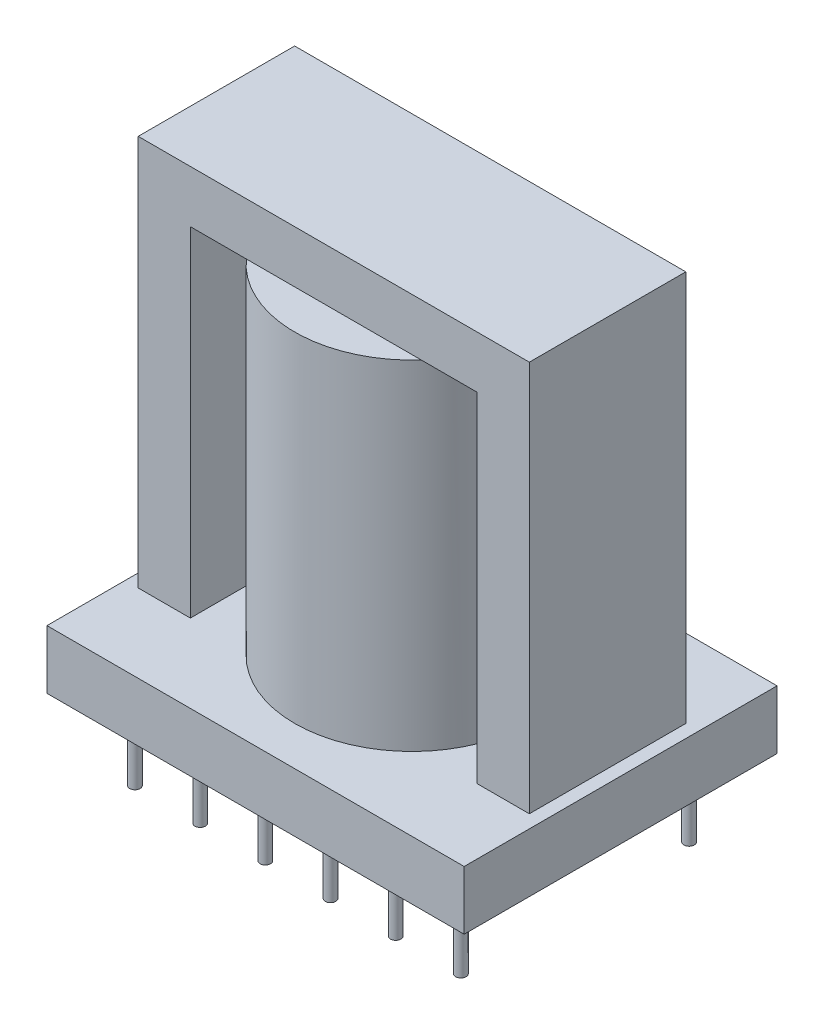
ISO-10303-21;
HEADER;
FILE_DESCRIPTION(('STEP AP214'),'2;1');
FILE_NAME('part.step','',(''),(''),'','','');
FILE_SCHEMA(('AUTOMOTIVE_DESIGN { 1 0 10303 214 1 1 1 1 }'));
ENDSEC;
DATA;
#1=APPLICATION_CONTEXT('core data for automotive mechanical design processes');
#2=APPLICATION_PROTOCOL_DEFINITION('international standard','automotive_design',2000,#1);
#3=PRODUCT_CONTEXT('',#1,'mechanical');
#4=PRODUCT('Part','Part','',(#3));
#5=PRODUCT_RELATED_PRODUCT_CATEGORY('part','',(#4));
#6=PRODUCT_DEFINITION_FORMATION('','',#4);
#7=PRODUCT_DEFINITION_CONTEXT('part definition',#1,'design');
#8=PRODUCT_DEFINITION('design','',#6,#7);
#9=PRODUCT_DEFINITION_SHAPE('','',#8);
#10=(LENGTH_UNIT() NAMED_UNIT(*) SI_UNIT(.MILLI.,.METRE.));
#11=(NAMED_UNIT(*) PLANE_ANGLE_UNIT() SI_UNIT($,.RADIAN.));
#12=(NAMED_UNIT(*) SI_UNIT($,.STERADIAN.) SOLID_ANGLE_UNIT());
#13=UNCERTAINTY_MEASURE_WITH_UNIT(LENGTH_MEASURE(1.E-05),#10,'distance_accuracy_value','');
#14=(GEOMETRIC_REPRESENTATION_CONTEXT(3) GLOBAL_UNCERTAINTY_ASSIGNED_CONTEXT((#13)) GLOBAL_UNIT_ASSIGNED_CONTEXT((#10,
#11,#12)) REPRESENTATION_CONTEXT('',''));
#15=CARTESIAN_POINT('',(0.,0.,0.));
#16=DIRECTION('',(0.,0.,1.));
#17=DIRECTION('',(1.,0.,0.));
#18=AXIS2_PLACEMENT_3D('',#15,#16,#17);
#19=CARTESIAN_POINT('',(0.,30.5,0.));
#20=DIRECTION('',(0.,1.,0.));
#21=DIRECTION('',(0.,0.,1.));
#22=AXIS2_PLACEMENT_3D('',#19,#20,#21);
#23=PLANE('',#22);
#24=DIRECTION('',(-1.,0.,0.));
#25=VECTOR('',#24,1.);
#26=CARTESIAN_POINT('',(-15.,30.5,-6.));
#27=LINE('',#26,#25);
#28=CARTESIAN_POINT('',(6.70820393249937,30.5,-6.));
#29=VERTEX_POINT('',#28);
#30=CARTESIAN_POINT('',(-6.70820393249937,30.5,-6.));
#31=VERTEX_POINT('',#30);
#32=EDGE_CURVE('E176',#29,#31,#27,.T.);
#33=ORIENTED_EDGE('',*,*,#32,.F.);
#34=CARTESIAN_POINT('',(0.,30.5,0.));
#35=DIRECTION('',(0.,1.,0.));
#36=DIRECTION('',(0.,0.,1.));
#37=AXIS2_PLACEMENT_3D('',#34,#35,#36);
#38=CIRCLE('',#37,9.);
#39=EDGE_CURVE('E224',#29,#31,#38,.T.);
#40=ORIENTED_EDGE('',*,*,#39,.T.);
#41=EDGE_LOOP('',(#33,#40));
#42=FACE_BOUND('',#41,.T.);
#43=ADVANCED_FACE('F37',(#42),#23,.T.);
#44=CARTESIAN_POINT('',(0.,4.5,0.));
#45=DIRECTION('',(0.,1.,0.));
#46=DIRECTION('',(0.,0.,1.));
#47=AXIS2_PLACEMENT_3D('',#44,#45,#46);
#48=PLANE('',#47);
#49=CARTESIAN_POINT('',(0.,4.5,0.));
#50=DIRECTION('',(0.,1.,0.));
#51=DIRECTION('',(0.,0.,1.));
#52=AXIS2_PLACEMENT_3D('',#49,#50,#51);
#53=CIRCLE('',#52,9.);
#54=CARTESIAN_POINT('',(0.,4.5,9.));
#55=VERTEX_POINT('',#54);
#56=EDGE_CURVE('E218',#55,#55,#53,.T.);
#57=ORIENTED_EDGE('',*,*,#56,.F.);
#58=EDGE_LOOP('',(#57));
#59=FACE_BOUND('',#58,.T.);
#60=DIRECTION('',(0.,0.,1.));
#61=VECTOR('',#60,1.);
#62=CARTESIAN_POINT('',(-16.,4.5,-12.));
#63=LINE('',#62,#61);
#64=CARTESIAN_POINT('',(-16.,4.5,-12.));
#65=VERTEX_POINT('',#64);
#66=CARTESIAN_POINT('',(-16.,4.5,12.));
#67=VERTEX_POINT('',#66);
#68=EDGE_CURVE('E259',#65,#67,#63,.T.);
#69=ORIENTED_EDGE('',*,*,#68,.T.);
#70=DIRECTION('',(1.,0.,0.));
#71=VECTOR('',#70,1.);
#72=CARTESIAN_POINT('',(-16.,4.5,12.));
#73=LINE('',#72,#71);
#74=CARTESIAN_POINT('',(16.,4.5,12.));
#75=VERTEX_POINT('',#74);
#76=EDGE_CURVE('E263',#67,#75,#73,.T.);
#77=ORIENTED_EDGE('',*,*,#76,.T.);
#78=DIRECTION('',(0.,0.,-1.));
#79=VECTOR('',#78,1.);
#80=CARTESIAN_POINT('',(16.,4.5,-12.));
#81=LINE('',#80,#79);
#82=CARTESIAN_POINT('',(16.,4.5,-12.));
#83=VERTEX_POINT('',#82);
#84=EDGE_CURVE('E267',#75,#83,#81,.T.);
#85=ORIENTED_EDGE('',*,*,#84,.T.);
#86=DIRECTION('',(-1.,0.,0.));
#87=VECTOR('',#86,1.);
#88=CARTESIAN_POINT('',(-16.,4.5,-12.));
#89=LINE('',#88,#87);
#90=EDGE_CURVE('E270',#83,#65,#89,.T.);
#91=ORIENTED_EDGE('',*,*,#90,.T.);
#92=EDGE_LOOP('',(#69,#77,#85,#91));
#93=FACE_BOUND('',#92,.T.);
#94=DIRECTION('',(1.,0.,0.));
#95=VECTOR('',#94,1.);
#96=CARTESIAN_POINT('',(11.,4.5,6.));
#97=LINE('',#96,#95);
#98=CARTESIAN_POINT('',(11.,4.5,6.));
#99=VERTEX_POINT('',#98);
#100=CARTESIAN_POINT('',(15.,4.5,6.));
#101=VERTEX_POINT('',#100);
#102=EDGE_CURVE('E238',#99,#101,#97,.T.);
#103=ORIENTED_EDGE('',*,*,#102,.F.);
#104=DIRECTION('',(0.,0.,1.));
#105=VECTOR('',#104,1.);
#106=CARTESIAN_POINT('',(11.,4.5,-6.));
#107=LINE('',#106,#105);
#108=CARTESIAN_POINT('',(11.,4.5,-6.));
#109=VERTEX_POINT('',#108);
#110=EDGE_CURVE('E223',#109,#99,#107,.T.);
#111=ORIENTED_EDGE('',*,*,#110,.F.);
#112=DIRECTION('',(-1.,0.,0.));
#113=VECTOR('',#112,1.);
#114=CARTESIAN_POINT('',(11.,4.5,-6.));
#115=LINE('',#114,#113);
#116=CARTESIAN_POINT('',(15.,4.5,-6.));
#117=VERTEX_POINT('',#116);
#118=EDGE_CURVE('E234',#117,#109,#115,.T.);
#119=ORIENTED_EDGE('',*,*,#118,.F.);
#120=DIRECTION('',(0.,0.,-1.));
#121=VECTOR('',#120,1.);
#122=CARTESIAN_POINT('',(15.,4.5,-6.));
#123=LINE('',#122,#121);
#124=EDGE_CURVE('E241',#101,#117,#123,.T.);
#125=ORIENTED_EDGE('',*,*,#124,.F.);
#126=EDGE_LOOP('',(#103,#111,#119,#125));
#127=FACE_BOUND('',#126,.T.);
#128=DIRECTION('',(0.,0.,1.));
#129=VECTOR('',#128,1.);
#130=CARTESIAN_POINT('',(-15.,4.5,-6.));
#131=LINE('',#130,#129);
#132=CARTESIAN_POINT('',(-15.,4.5,-6.));
#133=VERTEX_POINT('',#132);
#134=CARTESIAN_POINT('',(-15.,4.5,5.99999999999999));
#135=VERTEX_POINT('',#134);
#136=EDGE_CURVE('E147',#133,#135,#131,.T.);
#137=ORIENTED_EDGE('',*,*,#136,.F.);
#138=DIRECTION('',(-1.,0.,0.));
#139=VECTOR('',#138,1.);
#140=CARTESIAN_POINT('',(-11.,4.5,-6.));
#141=LINE('',#140,#139);
#142=CARTESIAN_POINT('',(-11.,4.5,-6.));
#143=VERTEX_POINT('',#142);
#144=EDGE_CURVE('E200',#143,#133,#141,.T.);
#145=ORIENTED_EDGE('',*,*,#144,.F.);
#146=DIRECTION('',(0.,0.,-1.));
#147=VECTOR('',#146,1.);
#148=CARTESIAN_POINT('',(-11.,4.5,-6.));
#149=LINE('',#148,#147);
#150=CARTESIAN_POINT('',(-11.,4.5,5.99999999999999));
#151=VERTEX_POINT('',#150);
#152=EDGE_CURVE('E199',#151,#143,#149,.T.);
#153=ORIENTED_EDGE('',*,*,#152,.F.);
#154=DIRECTION('',(1.,0.,0.));
#155=VECTOR('',#154,1.);
#156=CARTESIAN_POINT('',(-11.,4.5,5.99999999999999));
#157=LINE('',#156,#155);
#158=EDGE_CURVE('E206',#135,#151,#157,.T.);
#159=ORIENTED_EDGE('',*,*,#158,.F.);
#160=EDGE_LOOP('',(#137,#145,#153,#159));
#161=FACE_BOUND('',#160,.T.);
#162=ADVANCED_FACE('F389',(#59,#93,#127,#161),#48,.T.);
#163=CARTESIAN_POINT('',(-16.,4.5,-12.));
#164=DIRECTION('',(1.,0.,0.));
#165=DIRECTION('',(0.,0.,-1.));
#166=AXIS2_PLACEMENT_3D('',#163,#164,#165);
#167=PLANE('',#166);
#168=DIRECTION('',(0.,0.,1.));
#169=VECTOR('',#168,1.);
#170=CARTESIAN_POINT('',(-16.,0.,-12.));
#171=LINE('',#170,#169);
#172=CARTESIAN_POINT('',(-16.,0.,-12.));
#173=VERTEX_POINT('',#172);
#174=CARTESIAN_POINT('',(-16.,0.,12.));
#175=VERTEX_POINT('',#174);
#176=EDGE_CURVE('E258',#173,#175,#171,.T.);
#177=ORIENTED_EDGE('',*,*,#176,.T.);
#178=DIRECTION('',(0.,-1.,0.));
#179=VECTOR('',#178,1.);
#180=CARTESIAN_POINT('',(-16.,4.5,12.));
#181=LINE('',#180,#179);
#182=EDGE_CURVE('E296',#67,#175,#181,.T.);
#183=ORIENTED_EDGE('',*,*,#182,.F.);
#184=ORIENTED_EDGE('',*,*,#68,.F.);
#185=DIRECTION('',(0.,-1.,0.));
#186=VECTOR('',#185,1.);
#187=CARTESIAN_POINT('',(-16.,4.5,-12.));
#188=LINE('',#187,#186);
#189=EDGE_CURVE('E273',#65,#173,#188,.T.);
#190=ORIENTED_EDGE('',*,*,#189,.T.);
#191=EDGE_LOOP('',(#177,#183,#184,#190));
#192=FACE_BOUND('',#191,.T.);
#193=ADVANCED_FACE('F39',(#192),#167,.F.);
#194=CARTESIAN_POINT('',(-16.,4.5,12.));
#195=DIRECTION('',(0.,0.,-1.));
#196=DIRECTION('',(-1.,0.,0.));
#197=AXIS2_PLACEMENT_3D('',#194,#195,#196);
#198=PLANE('',#197);
#199=DIRECTION('',(1.,0.,0.));
#200=VECTOR('',#199,1.);
#201=CARTESIAN_POINT('',(-16.,0.,12.));
#202=LINE('',#201,#200);
#203=CARTESIAN_POINT('',(16.,0.,12.));
#204=VERTEX_POINT('',#203);
#205=EDGE_CURVE('E277',#175,#204,#202,.T.);
#206=ORIENTED_EDGE('',*,*,#205,.T.);
#207=DIRECTION('',(0.,-1.,0.));
#208=VECTOR('',#207,1.);
#209=CARTESIAN_POINT('',(16.,4.5,12.));
#210=LINE('',#209,#208);
#211=EDGE_CURVE('E292',#75,#204,#210,.T.);
#212=ORIENTED_EDGE('',*,*,#211,.F.);
#213=ORIENTED_EDGE('',*,*,#76,.F.);
#214=ORIENTED_EDGE('',*,*,#182,.T.);
#215=EDGE_LOOP('',(#206,#212,#213,#214));
#216=FACE_BOUND('',#215,.T.);
#217=ADVANCED_FACE('F387',(#216),#198,.F.);
#218=CARTESIAN_POINT('',(16.,4.5,-12.));
#219=DIRECTION('',(-1.,0.,0.));
#220=DIRECTION('',(0.,0.,1.));
#221=AXIS2_PLACEMENT_3D('',#218,#219,#220);
#222=PLANE('',#221);
#223=DIRECTION('',(0.,0.,-1.));
#224=VECTOR('',#223,1.);
#225=CARTESIAN_POINT('',(16.,0.,-12.));
#226=LINE('',#225,#224);
#227=CARTESIAN_POINT('',(16.,0.,-12.));
#228=VERTEX_POINT('',#227);
#229=EDGE_CURVE('E280',#204,#228,#226,.T.);
#230=ORIENTED_EDGE('',*,*,#229,.T.);
#231=DIRECTION('',(0.,-1.,0.));
#232=VECTOR('',#231,1.);
#233=CARTESIAN_POINT('',(16.,4.5,-12.));
#234=LINE('',#233,#232);
#235=EDGE_CURVE('E288',#83,#228,#234,.T.);
#236=ORIENTED_EDGE('',*,*,#235,.F.);
#237=ORIENTED_EDGE('',*,*,#84,.F.);
#238=ORIENTED_EDGE('',*,*,#211,.T.);
#239=EDGE_LOOP('',(#230,#236,#237,#238));
#240=FACE_BOUND('',#239,.T.);
#241=ADVANCED_FACE('F384',(#240),#222,.F.);
#242=CARTESIAN_POINT('',(-16.,4.5,-12.));
#243=DIRECTION('',(0.,0.,1.));
#244=DIRECTION('',(1.,0.,0.));
#245=AXIS2_PLACEMENT_3D('',#242,#243,#244);
#246=PLANE('',#245);
#247=DIRECTION('',(-1.,0.,0.));
#248=VECTOR('',#247,1.);
#249=CARTESIAN_POINT('',(-16.,0.,-12.));
#250=LINE('',#249,#248);
#251=EDGE_CURVE('E264',#228,#173,#250,.T.);
#252=ORIENTED_EDGE('',*,*,#251,.T.);
#253=ORIENTED_EDGE('',*,*,#189,.F.);
#254=ORIENTED_EDGE('',*,*,#90,.F.);
#255=ORIENTED_EDGE('',*,*,#235,.T.);
#256=EDGE_LOOP('',(#252,#253,#254,#255));
#257=FACE_BOUND('',#256,.T.);
#258=ADVANCED_FACE('F349',(#257),#246,.F.);
#259=CARTESIAN_POINT('',(0.,0.,0.));
#260=DIRECTION('',(0.,1.,0.));
#261=DIRECTION('',(0.,0.,1.));
#262=AXIS2_PLACEMENT_3D('',#259,#260,#261);
#263=PLANE('',#262);
#264=CARTESIAN_POINT('',(2.49999999999999,0.,8.75));
#265=DIRECTION('',(0.,1.,0.));
#266=DIRECTION('',(0.,0.,1.));
#267=AXIS2_PLACEMENT_3D('',#264,#265,#266);
#268=CIRCLE('',#267,0.4);
#269=CARTESIAN_POINT('',(2.49999999999999,0.,9.15));
#270=VERTEX_POINT('',#269);
#271=EDGE_CURVE('E11',#270,#270,#268,.F.);
#272=ORIENTED_EDGE('',*,*,#271,.F.);
#273=EDGE_LOOP('',(#272));
#274=FACE_BOUND('',#273,.T.);
#275=CARTESIAN_POINT('',(7.49999999999999,0.,8.75));
#276=DIRECTION('',(0.,1.,0.));
#277=DIRECTION('',(0.,0.,1.));
#278=AXIS2_PLACEMENT_3D('',#275,#276,#277);
#279=CIRCLE('',#278,0.399999999999999);
#280=CARTESIAN_POINT('',(7.49999999999999,0.,9.15));
#281=VERTEX_POINT('',#280);
#282=EDGE_CURVE('E46',#281,#281,#279,.F.);
#283=ORIENTED_EDGE('',*,*,#282,.F.);
#284=EDGE_LOOP('',(#283));
#285=FACE_BOUND('',#284,.T.);
#286=CARTESIAN_POINT('',(12.5,0.,8.75));
#287=DIRECTION('',(0.,1.,0.));
#288=DIRECTION('',(0.,0.,1.));
#289=AXIS2_PLACEMENT_3D('',#286,#287,#288);
#290=CIRCLE('',#289,0.399999999999999);
#291=CARTESIAN_POINT('',(12.5,0.,9.15));
#292=VERTEX_POINT('',#291);
#293=EDGE_CURVE('E336',#292,#292,#290,.F.);
#294=ORIENTED_EDGE('',*,*,#293,.F.);
#295=EDGE_LOOP('',(#294));
#296=FACE_BOUND('',#295,.T.);
#297=CARTESIAN_POINT('',(-12.5,0.,8.75));
#298=DIRECTION('',(0.,1.,0.));
#299=DIRECTION('',(0.,0.,1.));
#300=AXIS2_PLACEMENT_3D('',#297,#298,#299);
#301=CIRCLE('',#300,0.399999999999999);
#302=CARTESIAN_POINT('',(-12.5,0.,9.15));
#303=VERTEX_POINT('',#302);
#304=EDGE_CURVE('E332',#303,#303,#301,.F.);
#305=ORIENTED_EDGE('',*,*,#304,.F.);
#306=EDGE_LOOP('',(#305));
#307=FACE_BOUND('',#306,.T.);
#308=CARTESIAN_POINT('',(-7.50000000000001,0.,8.75));
#309=DIRECTION('',(0.,1.,0.));
#310=DIRECTION('',(0.,0.,1.));
#311=AXIS2_PLACEMENT_3D('',#308,#309,#310);
#312=CIRCLE('',#311,0.399999999999996);
#313=CARTESIAN_POINT('',(-7.50000000000001,0.,9.15));
#314=VERTEX_POINT('',#313);
#315=EDGE_CURVE('E328',#314,#314,#312,.F.);
#316=ORIENTED_EDGE('',*,*,#315,.F.);
#317=EDGE_LOOP('',(#316));
#318=FACE_BOUND('',#317,.T.);
#319=CARTESIAN_POINT('',(-2.50000000000001,0.,8.75));
#320=DIRECTION('',(0.,1.,0.));
#321=DIRECTION('',(0.,0.,1.));
#322=AXIS2_PLACEMENT_3D('',#319,#320,#321);
#323=CIRCLE('',#322,0.4);
#324=CARTESIAN_POINT('',(-2.50000000000001,0.,9.15));
#325=VERTEX_POINT('',#324);
#326=EDGE_CURVE('E324',#325,#325,#323,.F.);
#327=ORIENTED_EDGE('',*,*,#326,.F.);
#328=EDGE_LOOP('',(#327));
#329=FACE_BOUND('',#328,.T.);
#330=CARTESIAN_POINT('',(-2.5,0.,-8.75));
#331=DIRECTION('',(0.,1.,0.));
#332=DIRECTION('',(0.,0.,1.));
#333=AXIS2_PLACEMENT_3D('',#330,#331,#332);
#334=CIRCLE('',#333,0.4);
#335=CARTESIAN_POINT('',(-2.5,0.,-8.35));
#336=VERTEX_POINT('',#335);
#337=EDGE_CURVE('E320',#336,#336,#334,.F.);
#338=ORIENTED_EDGE('',*,*,#337,.F.);
#339=EDGE_LOOP('',(#338));
#340=FACE_BOUND('',#339,.T.);
#341=CARTESIAN_POINT('',(-7.5,0.,-8.75));
#342=DIRECTION('',(0.,1.,0.));
#343=DIRECTION('',(0.,0.,1.));
#344=AXIS2_PLACEMENT_3D('',#341,#342,#343);
#345=CIRCLE('',#344,0.399999999999999);
#346=CARTESIAN_POINT('',(-7.5,0.,-8.35));
#347=VERTEX_POINT('',#346);
#348=EDGE_CURVE('E316',#347,#347,#345,.F.);
#349=ORIENTED_EDGE('',*,*,#348,.F.);
#350=EDGE_LOOP('',(#349));
#351=FACE_BOUND('',#350,.T.);
#352=CARTESIAN_POINT('',(-12.5,0.,-8.75));
#353=DIRECTION('',(0.,1.,0.));
#354=DIRECTION('',(0.,0.,1.));
#355=AXIS2_PLACEMENT_3D('',#352,#353,#354);
#356=CIRCLE('',#355,0.399999999999999);
#357=CARTESIAN_POINT('',(-12.5,0.,-8.35));
#358=VERTEX_POINT('',#357);
#359=EDGE_CURVE('E312',#358,#358,#356,.F.);
#360=ORIENTED_EDGE('',*,*,#359,.F.);
#361=EDGE_LOOP('',(#360));
#362=FACE_BOUND('',#361,.T.);
#363=CARTESIAN_POINT('',(12.5,0.,-8.75));
#364=DIRECTION('',(0.,1.,0.));
#365=DIRECTION('',(0.,0.,1.));
#366=AXIS2_PLACEMENT_3D('',#363,#364,#365);
#367=CIRCLE('',#366,0.399999999999999);
#368=CARTESIAN_POINT('',(12.5,0.,-8.35));
#369=VERTEX_POINT('',#368);
#370=EDGE_CURVE('E308',#369,#369,#367,.F.);
#371=ORIENTED_EDGE('',*,*,#370,.F.);
#372=EDGE_LOOP('',(#371));
#373=FACE_BOUND('',#372,.T.);
#374=CARTESIAN_POINT('',(7.5,0.,-8.75));
#375=DIRECTION('',(0.,1.,0.));
#376=DIRECTION('',(0.,0.,1.));
#377=AXIS2_PLACEMENT_3D('',#374,#375,#376);
#378=CIRCLE('',#377,0.399999999999999);
#379=CARTESIAN_POINT('',(7.5,0.,-8.35));
#380=VERTEX_POINT('',#379);
#381=EDGE_CURVE('E304',#380,#380,#378,.F.);
#382=ORIENTED_EDGE('',*,*,#381,.F.);
#383=EDGE_LOOP('',(#382));
#384=FACE_BOUND('',#383,.T.);
#385=CARTESIAN_POINT('',(2.5,0.,-8.75));
#386=DIRECTION('',(0.,1.,0.));
#387=DIRECTION('',(0.,0.,1.));
#388=AXIS2_PLACEMENT_3D('',#385,#386,#387);
#389=CIRCLE('',#388,0.4);
#390=CARTESIAN_POINT('',(2.5,0.,-8.35));
#391=VERTEX_POINT('',#390);
#392=EDGE_CURVE('E300',#391,#391,#389,.F.);
#393=ORIENTED_EDGE('',*,*,#392,.F.);
#394=EDGE_LOOP('',(#393));
#395=FACE_BOUND('',#394,.T.);
#396=ORIENTED_EDGE('',*,*,#176,.F.);
#397=ORIENTED_EDGE('',*,*,#251,.F.);
#398=ORIENTED_EDGE('',*,*,#229,.F.);
#399=ORIENTED_EDGE('',*,*,#205,.F.);
#400=EDGE_LOOP('',(#396,#397,#398,#399));
#401=FACE_BOUND('',#400,.T.);
#402=ADVANCED_FACE('F345',(#274,#285,#296,#307,#318,#329,#340,#351,#362,#373,#384,#395,#401),
#263,.F.);
#403=CARTESIAN_POINT('',(11.,30.5,-6.));
#404=DIRECTION('',(1.,0.,0.));
#405=DIRECTION('',(0.,0.,-1.));
#406=AXIS2_PLACEMENT_3D('',#403,#404,#405);
#407=PLANE('',#406);
#408=ORIENTED_EDGE('',*,*,#110,.T.);
#409=DIRECTION('',(0.,-1.,0.));
#410=VECTOR('',#409,1.);
#411=CARTESIAN_POINT('',(11.,30.5,6.));
#412=LINE('',#411,#410);
#413=CARTESIAN_POINT('',(11.,30.5,6.));
#414=VERTEX_POINT('',#413);
#415=EDGE_CURVE('E255',#414,#99,#412,.T.);
#416=ORIENTED_EDGE('',*,*,#415,.F.);
#417=DIRECTION('',(0.,0.,1.));
#418=VECTOR('',#417,1.);
#419=CARTESIAN_POINT('',(11.,30.5,-6.));
#420=LINE('',#419,#418);
#421=CARTESIAN_POINT('',(11.,30.5,-6.));
#422=VERTEX_POINT('',#421);
#423=EDGE_CURVE('E229',#422,#414,#420,.T.);
#424=ORIENTED_EDGE('',*,*,#423,.F.);
#425=DIRECTION('',(0.,-1.,0.));
#426=VECTOR('',#425,1.);
#427=CARTESIAN_POINT('',(11.,30.5,-6.));
#428=LINE('',#427,#426);
#429=EDGE_CURVE('E233',#422,#109,#428,.T.);
#430=ORIENTED_EDGE('',*,*,#429,.T.);
#431=EDGE_LOOP('',(#408,#416,#424,#430));
#432=FACE_BOUND('',#431,.T.);
#433=ADVANCED_FACE('F348',(#432),#407,.F.);
#434=CARTESIAN_POINT('',(11.,30.5,6.));
#435=DIRECTION('',(0.,0.,-1.));
#436=DIRECTION('',(-1.,0.,0.));
#437=AXIS2_PLACEMENT_3D('',#434,#435,#436);
#438=PLANE('',#437);
#439=ORIENTED_EDGE('',*,*,#102,.T.);
#440=DIRECTION('',(0.,-1.,0.));
#441=VECTOR('',#440,1.);
#442=CARTESIAN_POINT('',(15.,30.5,6.));
#443=LINE('',#442,#441);
#444=CARTESIAN_POINT('',(15.,34.5,6.));
#445=VERTEX_POINT('',#444);
#446=EDGE_CURVE('E159',#445,#101,#443,.T.);
#447=ORIENTED_EDGE('',*,*,#446,.F.);
#448=DIRECTION('',(1.,0.,0.));
#449=VECTOR('',#448,1.);
#450=CARTESIAN_POINT('',(-15.,34.5,6.));
#451=LINE('',#450,#449);
#452=CARTESIAN_POINT('',(-15.,34.5,6.));
#453=VERTEX_POINT('',#452);
#454=EDGE_CURVE('E156',#453,#445,#451,.T.);
#455=ORIENTED_EDGE('',*,*,#454,.F.);
#456=DIRECTION('',(0.,-1.,0.));
#457=VECTOR('',#456,1.);
#458=CARTESIAN_POINT('',(-15.,30.5,5.99999999999999));
#459=LINE('',#458,#457);
#460=EDGE_CURVE('E141',#453,#135,#459,.T.);
#461=ORIENTED_EDGE('',*,*,#460,.T.);
#462=ORIENTED_EDGE('',*,*,#158,.T.);
#463=DIRECTION('',(0.,-1.,0.));
#464=VECTOR('',#463,1.);
#465=CARTESIAN_POINT('',(-11.,30.5,5.99999999999999));
#466=LINE('',#465,#464);
#467=CARTESIAN_POINT('',(-11.,30.5,5.99999999999999));
#468=VERTEX_POINT('',#467);
#469=EDGE_CURVE('E153',#468,#151,#466,.T.);
#470=ORIENTED_EDGE('',*,*,#469,.F.);
#471=DIRECTION('',(1.,0.,0.));
#472=VECTOR('',#471,1.);
#473=CARTESIAN_POINT('',(-15.,30.5,6.));
#474=LINE('',#473,#472);
#475=CARTESIAN_POINT('',(-6.70820393249937,30.5,6.));
#476=VERTEX_POINT('',#475);
#477=EDGE_CURVE('E190',#468,#476,#474,.T.);
#478=ORIENTED_EDGE('',*,*,#477,.T.);
#479=CARTESIAN_POINT('',(6.70820393249937,30.5,6.));
#480=VERTEX_POINT('',#479);
#481=EDGE_CURVE('E52',#476,#480,#474,.T.);
#482=ORIENTED_EDGE('',*,*,#481,.T.);
#483=EDGE_CURVE('E187',#480,#414,#474,.T.);
#484=ORIENTED_EDGE('',*,*,#483,.T.);
#485=ORIENTED_EDGE('',*,*,#415,.T.);
#486=EDGE_LOOP('',(#439,#447,#455,#461,#462,#470,#478,#482,#484,#485));
#487=FACE_BOUND('',#486,.T.);
#488=ADVANCED_FACE('F157',(#487),#438,.F.);
#489=CARTESIAN_POINT('',(15.,30.5,-6.));
#490=DIRECTION('',(-1.,0.,0.));
#491=DIRECTION('',(0.,0.,1.));
#492=AXIS2_PLACEMENT_3D('',#489,#490,#491);
#493=PLANE('',#492);
#494=ORIENTED_EDGE('',*,*,#124,.T.);
#495=DIRECTION('',(0.,-1.,0.));
#496=VECTOR('',#495,1.);
#497=CARTESIAN_POINT('',(15.,30.5,-6.));
#498=LINE('',#497,#496);
#499=CARTESIAN_POINT('',(15.,34.5,-6.));
#500=VERTEX_POINT('',#499);
#501=EDGE_CURVE('E250',#500,#117,#498,.T.);
#502=ORIENTED_EDGE('',*,*,#501,.F.);
#503=DIRECTION('',(0.,0.,-1.));
#504=VECTOR('',#503,1.);
#505=CARTESIAN_POINT('',(15.,34.5,-6.));
#506=LINE('',#505,#504);
#507=EDGE_CURVE('E164',#445,#500,#506,.T.);
#508=ORIENTED_EDGE('',*,*,#507,.F.);
#509=ORIENTED_EDGE('',*,*,#446,.T.);
#510=EDGE_LOOP('',(#494,#502,#508,#509));
#511=FACE_BOUND('',#510,.T.);
#512=ADVANCED_FACE('F420',(#511),#493,.F.);
#513=CARTESIAN_POINT('',(11.,30.5,-6.));
#514=DIRECTION('',(0.,0.,1.));
#515=DIRECTION('',(1.,0.,0.));
#516=AXIS2_PLACEMENT_3D('',#513,#514,#515);
#517=PLANE('',#516);
#518=ORIENTED_EDGE('',*,*,#118,.T.);
#519=ORIENTED_EDGE('',*,*,#429,.F.);
#520=EDGE_CURVE('E171',#422,#29,#27,.T.);
#521=ORIENTED_EDGE('',*,*,#520,.T.);
#522=ORIENTED_EDGE('',*,*,#32,.T.);
#523=CARTESIAN_POINT('',(-11.,30.5,-6.));
#524=VERTEX_POINT('',#523);
#525=EDGE_CURVE('E178',#31,#524,#27,.T.);
#526=ORIENTED_EDGE('',*,*,#525,.T.);
#527=DIRECTION('',(0.,-1.,0.));
#528=VECTOR('',#527,1.);
#529=CARTESIAN_POINT('',(-11.,30.5,-6.));
#530=LINE('',#529,#528);
#531=EDGE_CURVE('E198',#524,#143,#530,.T.);
#532=ORIENTED_EDGE('',*,*,#531,.T.);
#533=ORIENTED_EDGE('',*,*,#144,.T.);
#534=DIRECTION('',(0.,-1.,0.));
#535=VECTOR('',#534,1.);
#536=CARTESIAN_POINT('',(-15.,30.5,-6.));
#537=LINE('',#536,#535);
#538=CARTESIAN_POINT('',(-15.,34.5,-6.));
#539=VERTEX_POINT('',#538);
#540=EDGE_CURVE('E152',#539,#133,#537,.T.);
#541=ORIENTED_EDGE('',*,*,#540,.F.);
#542=DIRECTION('',(-1.,0.,0.));
#543=VECTOR('',#542,1.);
#544=CARTESIAN_POINT('',(-15.,34.5,-6.));
#545=LINE('',#544,#543);
#546=EDGE_CURVE('E169',#500,#539,#545,.T.);
#547=ORIENTED_EDGE('',*,*,#546,.F.);
#548=ORIENTED_EDGE('',*,*,#501,.T.);
#549=EDGE_LOOP('',(#518,#519,#521,#522,#526,#532,#533,#541,#547,#548));
#550=FACE_BOUND('',#549,.T.);
#551=ADVANCED_FACE('F418',(#550),#517,.F.);
#552=CARTESIAN_POINT('',(0.,30.5,0.));
#553=DIRECTION('',(0.,-1.,0.));
#554=DIRECTION('',(0.,0.,-1.));
#555=AXIS2_PLACEMENT_3D('',#552,#553,#554);
#556=CYLINDRICAL_SURFACE('',#555,9.);
#557=EDGE_CURVE('E219',#480,#29,#38,.T.);
#558=ORIENTED_EDGE('',*,*,#557,.F.);
#559=EDGE_CURVE('E225',#476,#480,#38,.T.);
#560=ORIENTED_EDGE('',*,*,#559,.F.);
#561=EDGE_CURVE('E59',#31,#476,#38,.T.);
#562=ORIENTED_EDGE('',*,*,#561,.F.);
#563=ORIENTED_EDGE('',*,*,#39,.F.);
#564=EDGE_LOOP('',(#558,#560,#562,#563));
#565=FACE_BOUND('',#564,.T.);
#566=ORIENTED_EDGE('',*,*,#56,.T.);
#567=EDGE_LOOP('',(#566));
#568=FACE_BOUND('',#567,.T.);
#569=ADVANCED_FACE('F427',(#565,#568),#556,.T.);
#570=ORIENTED_EDGE('',*,*,#481,.F.);
#571=ORIENTED_EDGE('',*,*,#559,.T.);
#572=EDGE_LOOP('',(#570,#571));
#573=FACE_BOUND('',#572,.T.);
#574=ADVANCED_FACE('F433',(#573),#23,.T.);
#575=CARTESIAN_POINT('',(-15.,30.5,-6.));
#576=DIRECTION('',(1.,0.,0.));
#577=DIRECTION('',(0.,0.,-1.));
#578=AXIS2_PLACEMENT_3D('',#575,#576,#577);
#579=PLANE('',#578);
#580=ORIENTED_EDGE('',*,*,#136,.T.);
#581=ORIENTED_EDGE('',*,*,#460,.F.);
#582=DIRECTION('',(0.,0.,1.));
#583=VECTOR('',#582,1.);
#584=CARTESIAN_POINT('',(-15.,34.5,-6.));
#585=LINE('',#584,#583);
#586=EDGE_CURVE('E145',#539,#453,#585,.T.);
#587=ORIENTED_EDGE('',*,*,#586,.F.);
#588=ORIENTED_EDGE('',*,*,#540,.T.);
#589=EDGE_LOOP('',(#580,#581,#587,#588));
#590=FACE_BOUND('',#589,.T.);
#591=ADVANCED_FACE('F143',(#590),#579,.F.);
#592=CARTESIAN_POINT('',(-11.,30.5,-6.));
#593=DIRECTION('',(-1.,0.,0.));
#594=DIRECTION('',(0.,0.,1.));
#595=AXIS2_PLACEMENT_3D('',#592,#593,#594);
#596=PLANE('',#595);
#597=ORIENTED_EDGE('',*,*,#152,.T.);
#598=ORIENTED_EDGE('',*,*,#531,.F.);
#599=DIRECTION('',(0.,0.,-1.));
#600=VECTOR('',#599,1.);
#601=CARTESIAN_POINT('',(-11.,30.5,-6.));
#602=LINE('',#601,#600);
#603=EDGE_CURVE('E194',#468,#524,#602,.T.);
#604=ORIENTED_EDGE('',*,*,#603,.F.);
#605=ORIENTED_EDGE('',*,*,#469,.T.);
#606=EDGE_LOOP('',(#597,#598,#604,#605));
#607=FACE_BOUND('',#606,.T.);
#608=ADVANCED_FACE('F404',(#607),#596,.F.);
#609=CARTESIAN_POINT('',(0.,30.5,0.));
#610=DIRECTION('',(0.,1.,0.));
#611=DIRECTION('',(0.,0.,1.));
#612=AXIS2_PLACEMENT_3D('',#609,#610,#611);
#613=PLANE('',#612);
#614=ORIENTED_EDGE('',*,*,#520,.F.);
#615=ORIENTED_EDGE('',*,*,#423,.T.);
#616=ORIENTED_EDGE('',*,*,#483,.F.);
#617=ORIENTED_EDGE('',*,*,#557,.T.);
#618=EDGE_LOOP('',(#614,#615,#616,#617));
#619=FACE_BOUND('',#618,.T.);
#620=ADVANCED_FACE('F413',(#619),#613,.F.);
#621=ORIENTED_EDGE('',*,*,#525,.F.);
#622=ORIENTED_EDGE('',*,*,#561,.T.);
#623=ORIENTED_EDGE('',*,*,#477,.F.);
#624=ORIENTED_EDGE('',*,*,#603,.T.);
#625=EDGE_LOOP('',(#621,#622,#623,#624));
#626=FACE_BOUND('',#625,.T.);
#627=ADVANCED_FACE('F407',(#626),#613,.F.);
#628=CARTESIAN_POINT('',(0.,34.5,0.));
#629=DIRECTION('',(0.,1.,0.));
#630=DIRECTION('',(0.,0.,1.));
#631=AXIS2_PLACEMENT_3D('',#628,#629,#630);
#632=PLANE('',#631);
#633=ORIENTED_EDGE('',*,*,#586,.T.);
#634=ORIENTED_EDGE('',*,*,#454,.T.);
#635=ORIENTED_EDGE('',*,*,#507,.T.);
#636=ORIENTED_EDGE('',*,*,#546,.T.);
#637=EDGE_LOOP('',(#633,#634,#635,#636));
#638=FACE_BOUND('',#637,.T.);
#639=ADVANCED_FACE('F167',(#638),#632,.T.);
#640=CARTESIAN_POINT('',(2.5,-6.,-8.75));
#641=DIRECTION('',(0.,1.,0.));
#642=DIRECTION('',(0.,0.,1.));
#643=AXIS2_PLACEMENT_3D('',#640,#641,#642);
#644=CYLINDRICAL_SURFACE('',#643,0.4);
#645=CARTESIAN_POINT('',(2.5,-6.,-8.75));
#646=DIRECTION('',(0.,-1.,0.));
#647=DIRECTION('',(0.,0.,-1.));
#648=AXIS2_PLACEMENT_3D('',#645,#646,#647);
#649=CIRCLE('',#648,0.4);
#650=CARTESIAN_POINT('',(2.5,-6.,-9.15));
#651=VERTEX_POINT('',#650);
#652=EDGE_CURVE('E180',#651,#651,#649,.T.);
#653=ORIENTED_EDGE('',*,*,#652,.F.);
#654=EDGE_LOOP('',(#653));
#655=FACE_BOUND('',#654,.T.);
#656=ORIENTED_EDGE('',*,*,#392,.T.);
#657=EDGE_LOOP('',(#656));
#658=FACE_BOUND('',#657,.T.);
#659=ADVANCED_FACE('F492',(#655,#658),#644,.T.);
#660=CARTESIAN_POINT('',(2.5,-6.,-8.75));
#661=DIRECTION('',(0.,-1.,0.));
#662=DIRECTION('',(0.,0.,-1.));
#663=AXIS2_PLACEMENT_3D('',#660,#661,#662);
#664=PLANE('',#663);
#665=ORIENTED_EDGE('',*,*,#652,.T.);
#666=EDGE_LOOP('',(#665));
#667=FACE_BOUND('',#666,.T.);
#668=ADVANCED_FACE('F490',(#667),#664,.T.);
#669=CARTESIAN_POINT('',(7.5,-6.,-8.75));
#670=DIRECTION('',(0.,1.,0.));
#671=DIRECTION('',(0.,0.,1.));
#672=AXIS2_PLACEMENT_3D('',#669,#670,#671);
#673=CYLINDRICAL_SURFACE('',#672,0.399999999999999);
#674=CARTESIAN_POINT('',(7.5,-6.,-8.75));
#675=DIRECTION('',(0.,-1.,0.));
#676=DIRECTION('',(0.,0.,-1.));
#677=AXIS2_PLACEMENT_3D('',#674,#675,#676);
#678=CIRCLE('',#677,0.399999999999999);
#679=CARTESIAN_POINT('',(7.5,-6.,-9.15));
#680=VERTEX_POINT('',#679);
#681=EDGE_CURVE('E482',#680,#680,#678,.T.);
#682=ORIENTED_EDGE('',*,*,#681,.F.);
#683=EDGE_LOOP('',(#682));
#684=FACE_BOUND('',#683,.T.);
#685=ORIENTED_EDGE('',*,*,#381,.T.);
#686=EDGE_LOOP('',(#685));
#687=FACE_BOUND('',#686,.T.);
#688=ADVANCED_FACE('F500',(#684,#687),#673,.T.);
#689=CARTESIAN_POINT('',(7.5,-6.,-8.75));
#690=DIRECTION('',(0.,-1.,0.));
#691=DIRECTION('',(0.,0.,-1.));
#692=AXIS2_PLACEMENT_3D('',#689,#690,#691);
#693=PLANE('',#692);
#694=ORIENTED_EDGE('',*,*,#681,.T.);
#695=EDGE_LOOP('',(#694));
#696=FACE_BOUND('',#695,.T.);
#697=ADVANCED_FACE('F538',(#696),#693,.T.);
#698=CARTESIAN_POINT('',(12.5,-6.,-8.75));
#699=DIRECTION('',(0.,1.,0.));
#700=DIRECTION('',(0.,0.,1.));
#701=AXIS2_PLACEMENT_3D('',#698,#699,#700);
#702=CYLINDRICAL_SURFACE('',#701,0.399999999999999);
#703=CARTESIAN_POINT('',(12.5,-6.,-8.75));
#704=DIRECTION('',(0.,-1.,0.));
#705=DIRECTION('',(0.,0.,-1.));
#706=AXIS2_PLACEMENT_3D('',#703,#704,#705);
#707=CIRCLE('',#706,0.399999999999999);
#708=CARTESIAN_POINT('',(12.5,-6.,-9.15));
#709=VERTEX_POINT('',#708);
#710=EDGE_CURVE('E473',#709,#709,#707,.T.);
#711=ORIENTED_EDGE('',*,*,#710,.F.);
#712=EDGE_LOOP('',(#711));
#713=FACE_BOUND('',#712,.T.);
#714=ORIENTED_EDGE('',*,*,#370,.T.);
#715=EDGE_LOOP('',(#714));
#716=FACE_BOUND('',#715,.T.);
#717=ADVANCED_FACE('F546',(#713,#716),#702,.T.);
#718=CARTESIAN_POINT('',(12.5,-6.,-8.75));
#719=DIRECTION('',(0.,-1.,0.));
#720=DIRECTION('',(0.,0.,-1.));
#721=AXIS2_PLACEMENT_3D('',#718,#719,#720);
#722=PLANE('',#721);
#723=ORIENTED_EDGE('',*,*,#710,.T.);
#724=EDGE_LOOP('',(#723));
#725=FACE_BOUND('',#724,.T.);
#726=ADVANCED_FACE('F554',(#725),#722,.T.);
#727=CARTESIAN_POINT('',(-12.5,-6.,-8.75));
#728=DIRECTION('',(0.,1.,0.));
#729=DIRECTION('',(0.,0.,1.));
#730=AXIS2_PLACEMENT_3D('',#727,#728,#729);
#731=CYLINDRICAL_SURFACE('',#730,0.399999999999999);
#732=CARTESIAN_POINT('',(-12.5,-6.,-8.75));
#733=DIRECTION('',(0.,-1.,0.));
#734=DIRECTION('',(0.,0.,1.));
#735=AXIS2_PLACEMENT_3D('',#732,#733,#734);
#736=CIRCLE('',#735,0.399999999999999);
#737=CARTESIAN_POINT('',(-12.5,-6.,-8.35));
#738=VERTEX_POINT('',#737);
#739=EDGE_CURVE('E468',#738,#738,#736,.T.);
#740=ORIENTED_EDGE('',*,*,#739,.F.);
#741=EDGE_LOOP('',(#740));
#742=FACE_BOUND('',#741,.T.);
#743=ORIENTED_EDGE('',*,*,#359,.T.);
#744=EDGE_LOOP('',(#743));
#745=FACE_BOUND('',#744,.T.);
#746=ADVANCED_FACE('F563',(#742,#745),#731,.T.);
#747=CARTESIAN_POINT('',(-12.5,-6.,-8.75));
#748=DIRECTION('',(0.,1.,0.));
#749=DIRECTION('',(0.,0.,1.));
#750=AXIS2_PLACEMENT_3D('',#747,#748,#749);
#751=PLANE('',#750);
#752=ORIENTED_EDGE('',*,*,#739,.T.);
#753=EDGE_LOOP('',(#752));
#754=FACE_BOUND('',#753,.T.);
#755=ADVANCED_FACE('F572',(#754),#751,.F.);
#756=CARTESIAN_POINT('',(-7.5,-6.,-8.75));
#757=DIRECTION('',(0.,1.,0.));
#758=DIRECTION('',(0.,0.,1.));
#759=AXIS2_PLACEMENT_3D('',#756,#757,#758);
#760=CYLINDRICAL_SURFACE('',#759,0.399999999999999);
#761=CARTESIAN_POINT('',(-7.5,-6.,-8.75));
#762=DIRECTION('',(0.,-1.,0.));
#763=DIRECTION('',(0.,0.,1.));
#764=AXIS2_PLACEMENT_3D('',#761,#762,#763);
#765=CIRCLE('',#764,0.399999999999999);
#766=CARTESIAN_POINT('',(-7.5,-6.,-8.35));
#767=VERTEX_POINT('',#766);
#768=EDGE_CURVE('E466',#767,#767,#765,.T.);
#769=ORIENTED_EDGE('',*,*,#768,.F.);
#770=EDGE_LOOP('',(#769));
#771=FACE_BOUND('',#770,.T.);
#772=ORIENTED_EDGE('',*,*,#348,.T.);
#773=EDGE_LOOP('',(#772));
#774=FACE_BOUND('',#773,.T.);
#775=ADVANCED_FACE('F581',(#771,#774),#760,.T.);
#776=CARTESIAN_POINT('',(-7.5,-6.,-8.75));
#777=DIRECTION('',(0.,1.,0.));
#778=DIRECTION('',(0.,0.,1.));
#779=AXIS2_PLACEMENT_3D('',#776,#777,#778);
#780=PLANE('',#779);
#781=ORIENTED_EDGE('',*,*,#768,.T.);
#782=EDGE_LOOP('',(#781));
#783=FACE_BOUND('',#782,.T.);
#784=ADVANCED_FACE('F590',(#783),#780,.F.);
#785=CARTESIAN_POINT('',(-2.5,-6.,-8.75));
#786=DIRECTION('',(0.,1.,0.));
#787=DIRECTION('',(0.,0.,1.));
#788=AXIS2_PLACEMENT_3D('',#785,#786,#787);
#789=CYLINDRICAL_SURFACE('',#788,0.4);
#790=CARTESIAN_POINT('',(-2.5,-6.,-8.75));
#791=DIRECTION('',(0.,-1.,0.));
#792=DIRECTION('',(0.,0.,1.));
#793=AXIS2_PLACEMENT_3D('',#790,#791,#792);
#794=CIRCLE('',#793,0.4);
#795=CARTESIAN_POINT('',(-2.5,-6.,-8.35));
#796=VERTEX_POINT('',#795);
#797=EDGE_CURVE('E453',#796,#796,#794,.T.);
#798=ORIENTED_EDGE('',*,*,#797,.F.);
#799=EDGE_LOOP('',(#798));
#800=FACE_BOUND('',#799,.T.);
#801=ORIENTED_EDGE('',*,*,#337,.T.);
#802=EDGE_LOOP('',(#801));
#803=FACE_BOUND('',#802,.T.);
#804=ADVANCED_FACE('F599',(#800,#803),#789,.T.);
#805=CARTESIAN_POINT('',(-2.5,-6.,-8.75));
#806=DIRECTION('',(0.,1.,0.));
#807=DIRECTION('',(0.,0.,1.));
#808=AXIS2_PLACEMENT_3D('',#805,#806,#807);
#809=PLANE('',#808);
#810=ORIENTED_EDGE('',*,*,#797,.T.);
#811=EDGE_LOOP('',(#810));
#812=FACE_BOUND('',#811,.T.);
#813=ADVANCED_FACE('F607',(#812),#809,.F.);
#814=CARTESIAN_POINT('',(-2.50000000000001,-6.,8.75));
#815=DIRECTION('',(0.,1.,0.));
#816=DIRECTION('',(0.,0.,1.));
#817=AXIS2_PLACEMENT_3D('',#814,#815,#816);
#818=CYLINDRICAL_SURFACE('',#817,0.4);
#819=CARTESIAN_POINT('',(-2.50000000000001,-6.,8.75));
#820=DIRECTION('',(0.,-1.,0.));
#821=DIRECTION('',(0.,0.,-1.));
#822=AXIS2_PLACEMENT_3D('',#819,#820,#821);
#823=CIRCLE('',#822,0.4);
#824=CARTESIAN_POINT('',(-2.50000000000001,-6.,8.35));
#825=VERTEX_POINT('',#824);
#826=EDGE_CURVE('E476',#825,#825,#823,.T.);
#827=ORIENTED_EDGE('',*,*,#826,.F.);
#828=EDGE_LOOP('',(#827));
#829=FACE_BOUND('',#828,.T.);
#830=ORIENTED_EDGE('',*,*,#326,.T.);
#831=EDGE_LOOP('',(#830));
#832=FACE_BOUND('',#831,.T.);
#833=ADVANCED_FACE('F616',(#829,#832),#818,.T.);
#834=CARTESIAN_POINT('',(-2.50000000000001,-6.,8.75));
#835=DIRECTION('',(0.,-1.,0.));
#836=DIRECTION('',(0.,0.,-1.));
#837=AXIS2_PLACEMENT_3D('',#834,#835,#836);
#838=PLANE('',#837);
#839=ORIENTED_EDGE('',*,*,#826,.T.);
#840=EDGE_LOOP('',(#839));
#841=FACE_BOUND('',#840,.T.);
#842=ADVANCED_FACE('F625',(#841),#838,.T.);
#843=CARTESIAN_POINT('',(-7.50000000000001,-6.,8.75));
#844=DIRECTION('',(0.,1.,0.));
#845=DIRECTION('',(0.,0.,1.));
#846=AXIS2_PLACEMENT_3D('',#843,#844,#845);
#847=CYLINDRICAL_SURFACE('',#846,0.399999999999996);
#848=CARTESIAN_POINT('',(-7.50000000000001,-6.,8.75));
#849=DIRECTION('',(0.,-1.,0.));
#850=DIRECTION('',(0.,0.,-1.));
#851=AXIS2_PLACEMENT_3D('',#848,#849,#850);
#852=CIRCLE('',#851,0.399999999999996);
#853=CARTESIAN_POINT('',(-7.50000000000001,-6.,8.35));
#854=VERTEX_POINT('',#853);
#855=EDGE_CURVE('E462',#854,#854,#852,.T.);
#856=ORIENTED_EDGE('',*,*,#855,.F.);
#857=EDGE_LOOP('',(#856));
#858=FACE_BOUND('',#857,.T.);
#859=ORIENTED_EDGE('',*,*,#315,.T.);
#860=EDGE_LOOP('',(#859));
#861=FACE_BOUND('',#860,.T.);
#862=ADVANCED_FACE('F634',(#858,#861),#847,.T.);
#863=CARTESIAN_POINT('',(-7.50000000000001,-6.,8.75));
#864=DIRECTION('',(0.,-1.,0.));
#865=DIRECTION('',(0.,0.,-1.));
#866=AXIS2_PLACEMENT_3D('',#863,#864,#865);
#867=PLANE('',#866);
#868=ORIENTED_EDGE('',*,*,#855,.T.);
#869=EDGE_LOOP('',(#868));
#870=FACE_BOUND('',#869,.T.);
#871=ADVANCED_FACE('F643',(#870),#867,.T.);
#872=CARTESIAN_POINT('',(-12.5,-6.,8.75));
#873=DIRECTION('',(0.,1.,0.));
#874=DIRECTION('',(0.,0.,1.));
#875=AXIS2_PLACEMENT_3D('',#872,#873,#874);
#876=CYLINDRICAL_SURFACE('',#875,0.399999999999999);
#877=CARTESIAN_POINT('',(-12.5,-6.,8.75));
#878=DIRECTION('',(0.,-1.,0.));
#879=DIRECTION('',(0.,0.,-1.));
#880=AXIS2_PLACEMENT_3D('',#877,#878,#879);
#881=CIRCLE('',#880,0.399999999999999);
#882=CARTESIAN_POINT('',(-12.5,-6.,8.35));
#883=VERTEX_POINT('',#882);
#884=EDGE_CURVE('E460',#883,#883,#881,.T.);
#885=ORIENTED_EDGE('',*,*,#884,.F.);
#886=EDGE_LOOP('',(#885));
#887=FACE_BOUND('',#886,.T.);
#888=ORIENTED_EDGE('',*,*,#304,.T.);
#889=EDGE_LOOP('',(#888));
#890=FACE_BOUND('',#889,.T.);
#891=ADVANCED_FACE('F652',(#887,#890),#876,.T.);
#892=CARTESIAN_POINT('',(-12.5,-6.,8.75));
#893=DIRECTION('',(0.,-1.,0.));
#894=DIRECTION('',(0.,0.,-1.));
#895=AXIS2_PLACEMENT_3D('',#892,#893,#894);
#896=PLANE('',#895);
#897=ORIENTED_EDGE('',*,*,#884,.T.);
#898=EDGE_LOOP('',(#897));
#899=FACE_BOUND('',#898,.T.);
#900=ADVANCED_FACE('F661',(#899),#896,.T.);
#901=CARTESIAN_POINT('',(12.5,-6.,8.75));
#902=DIRECTION('',(0.,1.,0.));
#903=DIRECTION('',(0.,0.,1.));
#904=AXIS2_PLACEMENT_3D('',#901,#902,#903);
#905=CYLINDRICAL_SURFACE('',#904,0.399999999999999);
#906=CARTESIAN_POINT('',(12.5,-6.,8.75));
#907=DIRECTION('',(0.,-1.,0.));
#908=DIRECTION('',(0.,0.,1.));
#909=AXIS2_PLACEMENT_3D('',#906,#907,#908);
#910=CIRCLE('',#909,0.399999999999999);
#911=CARTESIAN_POINT('',(12.5,-6.,9.15));
#912=VERTEX_POINT('',#911);
#913=EDGE_CURVE('E463',#912,#912,#910,.T.);
#914=ORIENTED_EDGE('',*,*,#913,.F.);
#915=EDGE_LOOP('',(#914));
#916=FACE_BOUND('',#915,.T.);
#917=ORIENTED_EDGE('',*,*,#293,.T.);
#918=EDGE_LOOP('',(#917));
#919=FACE_BOUND('',#918,.T.);
#920=ADVANCED_FACE('F670',(#916,#919),#905,.T.);
#921=CARTESIAN_POINT('',(12.5,-6.,8.75));
#922=DIRECTION('',(0.,1.,0.));
#923=DIRECTION('',(0.,0.,1.));
#924=AXIS2_PLACEMENT_3D('',#921,#922,#923);
#925=PLANE('',#924);
#926=ORIENTED_EDGE('',*,*,#913,.T.);
#927=EDGE_LOOP('',(#926));
#928=FACE_BOUND('',#927,.T.);
#929=ADVANCED_FACE('F679',(#928),#925,.F.);
#930=CARTESIAN_POINT('',(7.49999999999999,-6.,8.75));
#931=DIRECTION('',(0.,1.,0.));
#932=DIRECTION('',(0.,0.,1.));
#933=AXIS2_PLACEMENT_3D('',#930,#931,#932);
#934=CYLINDRICAL_SURFACE('',#933,0.399999999999999);
#935=CARTESIAN_POINT('',(7.49999999999999,-6.,8.75));
#936=DIRECTION('',(0.,-1.,0.));
#937=DIRECTION('',(0.,0.,1.));
#938=AXIS2_PLACEMENT_3D('',#935,#936,#937);
#939=CIRCLE('',#938,0.399999999999999);
#940=CARTESIAN_POINT('',(7.49999999999999,-6.,9.15));
#941=VERTEX_POINT('',#940);
#942=EDGE_CURVE('E458',#941,#941,#939,.T.);
#943=ORIENTED_EDGE('',*,*,#942,.F.);
#944=EDGE_LOOP('',(#943));
#945=FACE_BOUND('',#944,.T.);
#946=ORIENTED_EDGE('',*,*,#282,.T.);
#947=EDGE_LOOP('',(#946));
#948=FACE_BOUND('',#947,.T.);
#949=ADVANCED_FACE('F343',(#945,#948),#934,.T.);
#950=CARTESIAN_POINT('',(7.49999999999999,-6.,8.75));
#951=DIRECTION('',(0.,1.,0.));
#952=DIRECTION('',(0.,0.,1.));
#953=AXIS2_PLACEMENT_3D('',#950,#951,#952);
#954=PLANE('',#953);
#955=ORIENTED_EDGE('',*,*,#942,.T.);
#956=EDGE_LOOP('',(#955));
#957=FACE_BOUND('',#956,.T.);
#958=ADVANCED_FACE('F696',(#957),#954,.F.);
#959=CARTESIAN_POINT('',(2.49999999999999,-6.,8.75));
#960=DIRECTION('',(0.,1.,0.));
#961=DIRECTION('',(0.,0.,1.));
#962=AXIS2_PLACEMENT_3D('',#959,#960,#961);
#963=CYLINDRICAL_SURFACE('',#962,0.4);
#964=CARTESIAN_POINT('',(2.49999999999999,-6.,8.75));
#965=DIRECTION('',(0.,-1.,0.));
#966=DIRECTION('',(0.,0.,1.));
#967=AXIS2_PLACEMENT_3D('',#964,#965,#966);
#968=CIRCLE('',#967,0.4);
#969=CARTESIAN_POINT('',(2.49999999999999,-6.,9.15));
#970=VERTEX_POINT('',#969);
#971=EDGE_CURVE('E455',#970,#970,#968,.T.);
#972=ORIENTED_EDGE('',*,*,#971,.F.);
#973=EDGE_LOOP('',(#972));
#974=FACE_BOUND('',#973,.T.);
#975=ORIENTED_EDGE('',*,*,#271,.T.);
#976=EDGE_LOOP('',(#975));
#977=FACE_BOUND('',#976,.T.);
#978=ADVANCED_FACE('F705',(#974,#977),#963,.T.);
#979=CARTESIAN_POINT('',(2.49999999999999,-6.,8.75));
#980=DIRECTION('',(0.,1.,0.));
#981=DIRECTION('',(0.,0.,1.));
#982=AXIS2_PLACEMENT_3D('',#979,#980,#981);
#983=PLANE('',#982);
#984=ORIENTED_EDGE('',*,*,#971,.T.);
#985=EDGE_LOOP('',(#984));
#986=FACE_BOUND('',#985,.T.);
#987=ADVANCED_FACE('F714',(#986),#983,.F.);
#988=CLOSED_SHELL('',(#43,#162,#193,#217,#241,#258,#402,#433,#488,#512,#551,#569,#574,#591,#608,
#620,#627,#639,#659,#668,#688,#697,#717,#726,#746,#755,#775,#784,#804,#813,#833,#842,#862,#871,
#891,#900,#920,#929,#949,#958,#978,#987));
#989=MANIFOLD_SOLID_BREP('B2',#988);
#990=ADVANCED_BREP_SHAPE_REPRESENTATION('',(#18,#989),#14);
#991=SHAPE_DEFINITION_REPRESENTATION(#9,#990);
ENDSEC;
END-ISO-10303-21;
